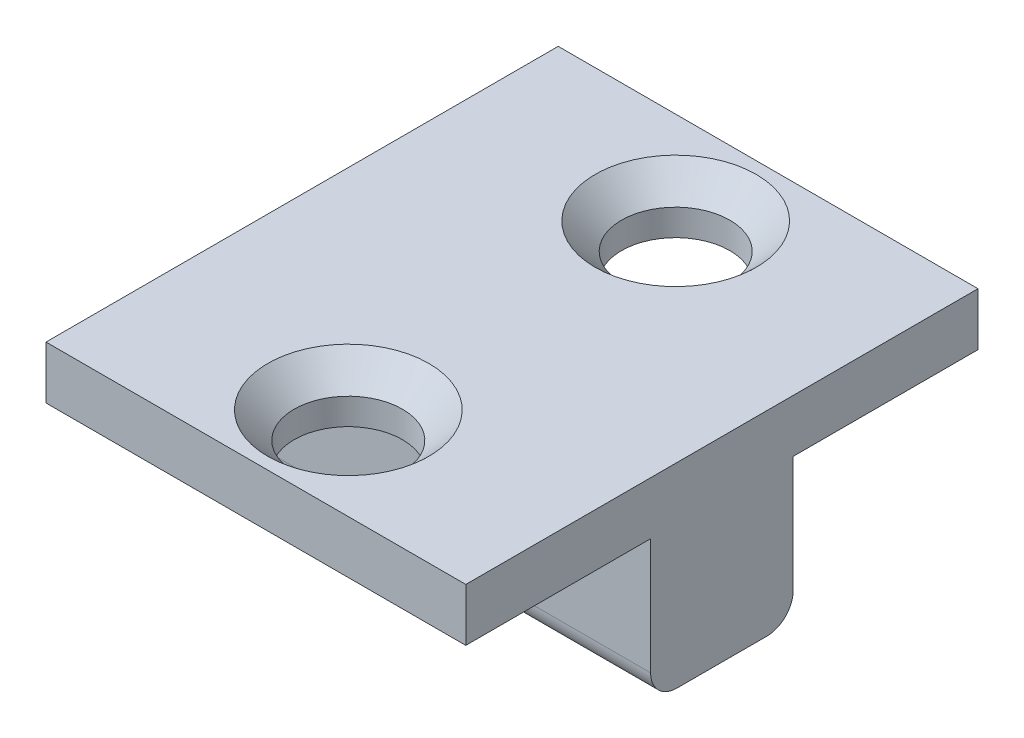
ISO-10303-21;
HEADER;
FILE_DESCRIPTION(('STEP AP214'),'2;1');
FILE_NAME('part.step','',(''),(''),'','','');
FILE_SCHEMA(('AUTOMOTIVE_DESIGN { 1 0 10303 214 1 1 1 1 }'));
ENDSEC;
DATA;
#1=APPLICATION_CONTEXT('core data for automotive mechanical design processes');
#2=APPLICATION_PROTOCOL_DEFINITION('international standard','automotive_design',2000,#1);
#3=PRODUCT_CONTEXT('',#1,'mechanical');
#4=PRODUCT('Part','Part','',(#3));
#5=PRODUCT_RELATED_PRODUCT_CATEGORY('part','',(#4));
#6=PRODUCT_DEFINITION_FORMATION('','',#4);
#7=PRODUCT_DEFINITION_CONTEXT('part definition',#1,'design');
#8=PRODUCT_DEFINITION('design','',#6,#7);
#9=PRODUCT_DEFINITION_SHAPE('','',#8);
#10=(LENGTH_UNIT() NAMED_UNIT(*) SI_UNIT(.MILLI.,.METRE.));
#11=(NAMED_UNIT(*) PLANE_ANGLE_UNIT() SI_UNIT($,.RADIAN.));
#12=(NAMED_UNIT(*) SI_UNIT($,.STERADIAN.) SOLID_ANGLE_UNIT());
#13=UNCERTAINTY_MEASURE_WITH_UNIT(LENGTH_MEASURE(1.E-05),#10,'distance_accuracy_value','');
#14=(GEOMETRIC_REPRESENTATION_CONTEXT(3) GLOBAL_UNCERTAINTY_ASSIGNED_CONTEXT((#13)) GLOBAL_UNIT_ASSIGNED_CONTEXT((#10,
#11,#12)) REPRESENTATION_CONTEXT('',''));
#15=CARTESIAN_POINT('',(0.,0.,0.));
#16=DIRECTION('',(0.,0.,1.));
#17=DIRECTION('',(1.,0.,0.));
#18=AXIS2_PLACEMENT_3D('',#15,#16,#17);
#19=CARTESIAN_POINT('',(7.94999999999999,5.4,-2.7));
#20=DIRECTION('',(-1.,0.,0.));
#21=DIRECTION('',(0.,0.,1.));
#22=AXIS2_PLACEMENT_3D('',#19,#20,#21);
#23=PLANE('',#22);
#24=DIRECTION('',(0.,-1.,0.));
#25=VECTOR('',#24,1.);
#26=CARTESIAN_POINT('',(7.94999999999999,5.4,2.7));
#27=LINE('',#26,#25);
#28=CARTESIAN_POINT('',(7.95,5.4,2.7));
#29=VERTEX_POINT('',#28);
#30=CARTESIAN_POINT('',(7.94999999999999,1.,2.7));
#31=VERTEX_POINT('',#30);
#32=EDGE_CURVE('E155',#29,#31,#27,.T.);
#33=ORIENTED_EDGE('',*,*,#32,.T.);
#34=CARTESIAN_POINT('',(7.94999999999999,1.,1.7));
#35=DIRECTION('',(-1.,0.,0.));
#36=DIRECTION('',(0.,0.,1.));
#37=AXIS2_PLACEMENT_3D('',#34,#35,#36);
#38=CIRCLE('',#37,1.);
#39=CARTESIAN_POINT('',(7.94999999999999,0.,1.7));
#40=VERTEX_POINT('',#39);
#41=EDGE_CURVE('E186',#31,#40,#38,.F.);
#42=ORIENTED_EDGE('',*,*,#41,.T.);
#43=DIRECTION('',(0.,0.,-1.));
#44=VECTOR('',#43,1.);
#45=CARTESIAN_POINT('',(7.94999999999999,0.,-2.7));
#46=LINE('',#45,#44);
#47=CARTESIAN_POINT('',(7.94999999999999,0.,-1.7));
#48=VERTEX_POINT('',#47);
#49=EDGE_CURVE('E141',#40,#48,#46,.T.);
#50=ORIENTED_EDGE('',*,*,#49,.T.);
#51=CARTESIAN_POINT('',(7.94999999999999,1.,-1.7));
#52=DIRECTION('',(-1.,0.,0.));
#53=DIRECTION('',(0.,0.,1.));
#54=AXIS2_PLACEMENT_3D('',#51,#52,#53);
#55=CIRCLE('',#54,1.);
#56=CARTESIAN_POINT('',(7.94999999999999,1.,-2.7));
#57=VERTEX_POINT('',#56);
#58=EDGE_CURVE('E184',#48,#57,#55,.F.);
#59=ORIENTED_EDGE('',*,*,#58,.T.);
#60=DIRECTION('',(0.,-1.,0.));
#61=VECTOR('',#60,1.);
#62=CARTESIAN_POINT('',(7.94999999999999,5.4,-2.7));
#63=LINE('',#62,#61);
#64=CARTESIAN_POINT('',(7.94999999999999,5.4,-2.7));
#65=VERTEX_POINT('',#64);
#66=EDGE_CURVE('E166',#65,#57,#63,.T.);
#67=ORIENTED_EDGE('',*,*,#66,.F.);
#68=DIRECTION('',(0.,0.,-1.));
#69=VECTOR('',#68,1.);
#70=CARTESIAN_POINT('',(7.95,5.4,-9.7));
#71=LINE('',#70,#69);
#72=CARTESIAN_POINT('',(7.95,5.4,-9.7));
#73=VERTEX_POINT('',#72);
#74=EDGE_CURVE('E212',#65,#73,#71,.T.);
#75=ORIENTED_EDGE('',*,*,#74,.T.);
#76=DIRECTION('',(0.,-1.,0.));
#77=VECTOR('',#76,1.);
#78=CARTESIAN_POINT('',(7.95,7.4,-9.7));
#79=LINE('',#78,#77);
#80=CARTESIAN_POINT('',(7.95,7.4,-9.7));
#81=VERTEX_POINT('',#80);
#82=EDGE_CURVE('E146',#81,#73,#79,.T.);
#83=ORIENTED_EDGE('',*,*,#82,.F.);
#84=DIRECTION('',(0.,0.,-1.));
#85=VECTOR('',#84,1.);
#86=CARTESIAN_POINT('',(7.95,7.4,-9.7));
#87=LINE('',#86,#85);
#88=CARTESIAN_POINT('',(7.95,7.4,9.7));
#89=VERTEX_POINT('',#88);
#90=EDGE_CURVE('E125',#89,#81,#87,.T.);
#91=ORIENTED_EDGE('',*,*,#90,.F.);
#92=DIRECTION('',(0.,-1.,0.));
#93=VECTOR('',#92,1.);
#94=CARTESIAN_POINT('',(7.95,7.4,9.7));
#95=LINE('',#94,#93);
#96=CARTESIAN_POINT('',(7.95,5.4,9.7));
#97=VERTEX_POINT('',#96);
#98=EDGE_CURVE('E122',#89,#97,#95,.T.);
#99=ORIENTED_EDGE('',*,*,#98,.T.);
#100=EDGE_CURVE('E221',#97,#29,#71,.T.);
#101=ORIENTED_EDGE('',*,*,#100,.T.);
#102=EDGE_LOOP('',(#33,#42,#50,#59,#67,#75,#83,#91,#99,#101));
#103=FACE_BOUND('',#102,.T.);
#104=ADVANCED_FACE('F37',(#103),#23,.F.);
#105=CARTESIAN_POINT('',(-7.95000000000001,5.4,-2.7));
#106=DIRECTION('',(0.,0.,1.));
#107=DIRECTION('',(1.,0.,0.));
#108=AXIS2_PLACEMENT_3D('',#105,#106,#107);
#109=PLANE('',#108);
#110=ORIENTED_EDGE('',*,*,#66,.T.);
#111=DIRECTION('',(-1.,0.,0.));
#112=VECTOR('',#111,1.);
#113=CARTESIAN_POINT('',(-7.95000000000001,1.,-2.7));
#114=LINE('',#113,#112);
#115=CARTESIAN_POINT('',(-7.95000000000001,1.,-2.7));
#116=VERTEX_POINT('',#115);
#117=EDGE_CURVE('E11',#57,#116,#114,.T.);
#118=ORIENTED_EDGE('',*,*,#117,.T.);
#119=DIRECTION('',(0.,-1.,0.));
#120=VECTOR('',#119,1.);
#121=CARTESIAN_POINT('',(-7.95000000000001,5.4,-2.7));
#122=LINE('',#121,#120);
#123=CARTESIAN_POINT('',(-7.95000000000001,5.4,-2.7));
#124=VERTEX_POINT('',#123);
#125=EDGE_CURVE('E163',#124,#116,#122,.T.);
#126=ORIENTED_EDGE('',*,*,#125,.F.);
#127=DIRECTION('',(-1.,0.,0.));
#128=VECTOR('',#127,1.);
#129=CARTESIAN_POINT('',(-7.95000000000001,5.4,-2.7));
#130=LINE('',#129,#128);
#131=EDGE_CURVE('E150',#65,#124,#130,.T.);
#132=ORIENTED_EDGE('',*,*,#131,.F.);
#133=EDGE_LOOP('',(#110,#118,#126,#132));
#134=FACE_BOUND('',#133,.T.);
#135=ADVANCED_FACE('F205',(#134),#109,.F.);
#136=CARTESIAN_POINT('',(-7.95000000000001,5.4,-2.7));
#137=DIRECTION('',(1.,0.,0.));
#138=DIRECTION('',(0.,0.,-1.));
#139=AXIS2_PLACEMENT_3D('',#136,#137,#138);
#140=PLANE('',#139);
#141=DIRECTION('',(0.,0.,1.));
#142=VECTOR('',#141,1.);
#143=CARTESIAN_POINT('',(-7.95000000000001,0.,-2.7));
#144=LINE('',#143,#142);
#145=CARTESIAN_POINT('',(-7.95000000000001,0.,-1.7));
#146=VERTEX_POINT('',#145);
#147=CARTESIAN_POINT('',(-7.95000000000001,0.,1.7));
#148=VERTEX_POINT('',#147);
#149=EDGE_CURVE('E144',#146,#148,#144,.T.);
#150=ORIENTED_EDGE('',*,*,#149,.T.);
#151=CARTESIAN_POINT('',(-7.95000000000001,1.,1.7));
#152=DIRECTION('',(1.,0.,0.));
#153=DIRECTION('',(0.,0.,-1.));
#154=AXIS2_PLACEMENT_3D('',#151,#152,#153);
#155=CIRCLE('',#154,1.);
#156=CARTESIAN_POINT('',(-7.95000000000001,1.,2.7));
#157=VERTEX_POINT('',#156);
#158=EDGE_CURVE('E45',#148,#157,#155,.F.);
#159=ORIENTED_EDGE('',*,*,#158,.T.);
#160=DIRECTION('',(0.,-1.,0.));
#161=VECTOR('',#160,1.);
#162=CARTESIAN_POINT('',(-7.95000000000001,5.4,2.7));
#163=LINE('',#162,#161);
#164=CARTESIAN_POINT('',(-7.95000000000001,5.4,2.7));
#165=VERTEX_POINT('',#164);
#166=EDGE_CURVE('E160',#165,#157,#163,.T.);
#167=ORIENTED_EDGE('',*,*,#166,.F.);
#168=DIRECTION('',(0.,0.,1.));
#169=VECTOR('',#168,1.);
#170=CARTESIAN_POINT('',(-7.95,5.4,-9.7));
#171=LINE('',#170,#169);
#172=CARTESIAN_POINT('',(-7.95,5.4,9.7));
#173=VERTEX_POINT('',#172);
#174=EDGE_CURVE('E139',#165,#173,#171,.T.);
#175=ORIENTED_EDGE('',*,*,#174,.T.);
#176=DIRECTION('',(0.,-1.,0.));
#177=VECTOR('',#176,1.);
#178=CARTESIAN_POINT('',(-7.95,7.4,9.7));
#179=LINE('',#178,#177);
#180=CARTESIAN_POINT('',(-7.95,7.4,9.7));
#181=VERTEX_POINT('',#180);
#182=EDGE_CURVE('E120',#181,#173,#179,.T.);
#183=ORIENTED_EDGE('',*,*,#182,.F.);
#184=DIRECTION('',(0.,0.,1.));
#185=VECTOR('',#184,1.);
#186=CARTESIAN_POINT('',(-7.95,7.4,-9.7));
#187=LINE('',#186,#185);
#188=CARTESIAN_POINT('',(-7.95,7.4,-9.7));
#189=VERTEX_POINT('',#188);
#190=EDGE_CURVE('E126',#189,#181,#187,.T.);
#191=ORIENTED_EDGE('',*,*,#190,.F.);
#192=DIRECTION('',(0.,-1.,0.));
#193=VECTOR('',#192,1.);
#194=CARTESIAN_POINT('',(-7.95,7.4,-9.7));
#195=LINE('',#194,#193);
#196=CARTESIAN_POINT('',(-7.95,5.4,-9.7));
#197=VERTEX_POINT('',#196);
#198=EDGE_CURVE('E213',#189,#197,#195,.T.);
#199=ORIENTED_EDGE('',*,*,#198,.T.);
#200=EDGE_CURVE('E211',#197,#124,#171,.T.);
#201=ORIENTED_EDGE('',*,*,#200,.T.);
#202=ORIENTED_EDGE('',*,*,#125,.T.);
#203=CARTESIAN_POINT('',(-7.95000000000001,1.,-1.7));
#204=DIRECTION('',(1.,0.,0.));
#205=DIRECTION('',(0.,0.,-1.));
#206=AXIS2_PLACEMENT_3D('',#203,#204,#205);
#207=CIRCLE('',#206,1.);
#208=EDGE_CURVE('E52',#116,#146,#207,.F.);
#209=ORIENTED_EDGE('',*,*,#208,.T.);
#210=EDGE_LOOP('',(#150,#159,#167,#175,#183,#191,#199,#201,#202,#209));
#211=FACE_BOUND('',#210,.T.);
#212=ADVANCED_FACE('F137',(#211),#140,.F.);
#213=CARTESIAN_POINT('',(-7.95000000000001,5.4,2.7));
#214=DIRECTION('',(0.,0.,-1.));
#215=DIRECTION('',(-1.,0.,0.));
#216=AXIS2_PLACEMENT_3D('',#213,#214,#215);
#217=PLANE('',#216);
#218=ORIENTED_EDGE('',*,*,#166,.T.);
#219=DIRECTION('',(1.,0.,0.));
#220=VECTOR('',#219,1.);
#221=CARTESIAN_POINT('',(-7.95000000000001,1.,2.7));
#222=LINE('',#221,#220);
#223=EDGE_CURVE('E181',#157,#31,#222,.T.);
#224=ORIENTED_EDGE('',*,*,#223,.T.);
#225=ORIENTED_EDGE('',*,*,#32,.F.);
#226=DIRECTION('',(1.,0.,0.));
#227=VECTOR('',#226,1.);
#228=CARTESIAN_POINT('',(-7.95000000000001,5.4,2.7));
#229=LINE('',#228,#227);
#230=EDGE_CURVE('E153',#165,#29,#229,.T.);
#231=ORIENTED_EDGE('',*,*,#230,.F.);
#232=EDGE_LOOP('',(#218,#224,#225,#231));
#233=FACE_BOUND('',#232,.T.);
#234=ADVANCED_FACE('F196',(#233),#217,.F.);
#235=CARTESIAN_POINT('',(0.,0.,0.));
#236=DIRECTION('',(0.,1.,0.));
#237=DIRECTION('',(0.,0.,1.));
#238=AXIS2_PLACEMENT_3D('',#235,#236,#237);
#239=PLANE('',#238);
#240=ORIENTED_EDGE('',*,*,#49,.F.);
#241=DIRECTION('',(1.,0.,0.));
#242=VECTOR('',#241,1.);
#243=CARTESIAN_POINT('',(0.,0.,1.7));
#244=LINE('',#243,#242);
#245=EDGE_CURVE('E59',#40,#148,#244,.F.);
#246=ORIENTED_EDGE('',*,*,#245,.T.);
#247=ORIENTED_EDGE('',*,*,#149,.F.);
#248=DIRECTION('',(-1.,0.,0.));
#249=VECTOR('',#248,1.);
#250=CARTESIAN_POINT('',(0.,0.,-1.7));
#251=LINE('',#250,#249);
#252=EDGE_CURVE('E188',#146,#48,#251,.F.);
#253=ORIENTED_EDGE('',*,*,#252,.T.);
#254=EDGE_LOOP('',(#240,#246,#247,#253));
#255=FACE_BOUND('',#254,.T.);
#256=ADVANCED_FACE('F201',(#255),#239,.F.);
#257=CARTESIAN_POINT('',(0.,5.4,0.));
#258=DIRECTION('',(0.,-1.,0.));
#259=DIRECTION('',(0.,0.,-1.));
#260=AXIS2_PLACEMENT_3D('',#257,#258,#259);
#261=PLANE('',#260);
#262=CARTESIAN_POINT('',(0.,5.4,-6.2));
#263=DIRECTION('',(0.,-1.,0.));
#264=DIRECTION('',(0.,0.,-1.));
#265=AXIS2_PLACEMENT_3D('',#262,#263,#264);
#266=CIRCLE('',#265,2.05);
#267=CARTESIAN_POINT('',(0.,5.4,-8.25));
#268=VERTEX_POINT('',#267);
#269=EDGE_CURVE('E217',#268,#268,#266,.T.);
#270=ORIENTED_EDGE('',*,*,#269,.F.);
#271=EDGE_LOOP('',(#270));
#272=FACE_BOUND('',#271,.T.);
#273=ORIENTED_EDGE('',*,*,#74,.F.);
#274=ORIENTED_EDGE('',*,*,#131,.T.);
#275=ORIENTED_EDGE('',*,*,#200,.F.);
#276=DIRECTION('',(-1.,0.,0.));
#277=VECTOR('',#276,1.);
#278=CARTESIAN_POINT('',(7.95,5.4,-9.7));
#279=LINE('',#278,#277);
#280=EDGE_CURVE('E135',#73,#197,#279,.T.);
#281=ORIENTED_EDGE('',*,*,#280,.F.);
#282=EDGE_LOOP('',(#273,#274,#275,#281));
#283=FACE_BOUND('',#282,.T.);
#284=ADVANCED_FACE('F209',(#272,#283),#261,.T.);
#285=CARTESIAN_POINT('',(7.95,7.4,9.7));
#286=DIRECTION('',(0.,0.,-1.));
#287=DIRECTION('',(-1.,0.,0.));
#288=AXIS2_PLACEMENT_3D('',#285,#286,#287);
#289=PLANE('',#288);
#290=DIRECTION('',(1.,0.,0.));
#291=VECTOR('',#290,1.);
#292=CARTESIAN_POINT('',(7.95,5.4,9.7));
#293=LINE('',#292,#291);
#294=EDGE_CURVE('E214',#173,#97,#293,.T.);
#295=ORIENTED_EDGE('',*,*,#294,.T.);
#296=ORIENTED_EDGE('',*,*,#98,.F.);
#297=DIRECTION('',(1.,0.,0.));
#298=VECTOR('',#297,1.);
#299=CARTESIAN_POINT('',(7.95,7.4,9.7));
#300=LINE('',#299,#298);
#301=EDGE_CURVE('E116',#181,#89,#300,.T.);
#302=ORIENTED_EDGE('',*,*,#301,.F.);
#303=ORIENTED_EDGE('',*,*,#182,.T.);
#304=EDGE_LOOP('',(#295,#296,#302,#303));
#305=FACE_BOUND('',#304,.T.);
#306=ADVANCED_FACE('F118',(#305),#289,.F.);
#307=CARTESIAN_POINT('',(7.95,7.4,-9.7));
#308=DIRECTION('',(0.,0.,1.));
#309=DIRECTION('',(1.,0.,0.));
#310=AXIS2_PLACEMENT_3D('',#307,#308,#309);
#311=PLANE('',#310);
#312=ORIENTED_EDGE('',*,*,#280,.T.);
#313=ORIENTED_EDGE('',*,*,#198,.F.);
#314=DIRECTION('',(-1.,0.,0.));
#315=VECTOR('',#314,1.);
#316=CARTESIAN_POINT('',(7.95,7.4,-9.7));
#317=LINE('',#316,#315);
#318=EDGE_CURVE('E131',#81,#189,#317,.T.);
#319=ORIENTED_EDGE('',*,*,#318,.F.);
#320=ORIENTED_EDGE('',*,*,#82,.T.);
#321=EDGE_LOOP('',(#312,#313,#319,#320));
#322=FACE_BOUND('',#321,.T.);
#323=ADVANCED_FACE('F227',(#322),#311,.F.);
#324=CARTESIAN_POINT('',(0.,7.4,0.));
#325=DIRECTION('',(0.,-1.,0.));
#326=DIRECTION('',(0.,0.,-1.));
#327=AXIS2_PLACEMENT_3D('',#324,#325,#326);
#328=PLANE('',#327);
#329=CARTESIAN_POINT('',(0.,7.4,6.2));
#330=DIRECTION('',(0.,-1.,0.));
#331=DIRECTION('',(0.,0.,-1.));
#332=AXIS2_PLACEMENT_3D('',#329,#330,#331);
#333=CIRCLE('',#332,3.05000000000001);
#334=CARTESIAN_POINT('',(0.,7.4,3.14999999999999));
#335=VERTEX_POINT('',#334);
#336=EDGE_CURVE('E175',#335,#335,#333,.T.);
#337=ORIENTED_EDGE('',*,*,#336,.T.);
#338=EDGE_LOOP('',(#337));
#339=FACE_BOUND('',#338,.T.);
#340=CARTESIAN_POINT('',(0.,7.4,-6.2));
#341=DIRECTION('',(0.,-1.,0.));
#342=DIRECTION('',(0.,0.,-1.));
#343=AXIS2_PLACEMENT_3D('',#340,#341,#342);
#344=CIRCLE('',#343,3.05);
#345=CARTESIAN_POINT('',(0.,7.4,-9.25000000000001));
#346=VERTEX_POINT('',#345);
#347=EDGE_CURVE('E172',#346,#346,#344,.T.);
#348=ORIENTED_EDGE('',*,*,#347,.T.);
#349=EDGE_LOOP('',(#348));
#350=FACE_BOUND('',#349,.T.);
#351=ORIENTED_EDGE('',*,*,#190,.T.);
#352=ORIENTED_EDGE('',*,*,#301,.T.);
#353=ORIENTED_EDGE('',*,*,#90,.T.);
#354=ORIENTED_EDGE('',*,*,#318,.T.);
#355=EDGE_LOOP('',(#351,#352,#353,#354));
#356=FACE_BOUND('',#355,.T.);
#357=ADVANCED_FACE('F129',(#339,#350,#356),#328,.F.);
#358=CARTESIAN_POINT('',(0.,5.4,6.2));
#359=DIRECTION('',(0.,1.,0.));
#360=DIRECTION('',(0.,0.,1.));
#361=AXIS2_PLACEMENT_3D('',#358,#359,#360);
#362=CIRCLE('',#361,2.05);
#363=CARTESIAN_POINT('',(0.,5.4,8.25));
#364=VERTEX_POINT('',#363);
#365=EDGE_CURVE('E232',#364,#364,#362,.T.);
#366=ORIENTED_EDGE('',*,*,#365,.T.);
#367=EDGE_LOOP('',(#366));
#368=FACE_BOUND('',#367,.T.);
#369=ORIENTED_EDGE('',*,*,#174,.F.);
#370=ORIENTED_EDGE('',*,*,#230,.T.);
#371=ORIENTED_EDGE('',*,*,#100,.F.);
#372=ORIENTED_EDGE('',*,*,#294,.F.);
#373=EDGE_LOOP('',(#369,#370,#371,#372));
#374=FACE_BOUND('',#373,.T.);
#375=ADVANCED_FACE('F236',(#368,#374),#261,.T.);
#376=CARTESIAN_POINT('',(0.,7.4,-6.2));
#377=DIRECTION('',(0.,-1.,0.));
#378=DIRECTION('',(0.,0.,-1.));
#379=AXIS2_PLACEMENT_3D('',#376,#377,#378);
#380=CYLINDRICAL_SURFACE('',#379,2.05);
#381=CARTESIAN_POINT('',(0.,6.4,-6.2));
#382=DIRECTION('',(0.,-1.,0.));
#383=DIRECTION('',(0.,0.,-1.));
#384=AXIS2_PLACEMENT_3D('',#381,#382,#383);
#385=CIRCLE('',#384,2.05);
#386=CARTESIAN_POINT('',(0.,6.4,-8.25));
#387=VERTEX_POINT('',#386);
#388=EDGE_CURVE('E178',#387,#387,#385,.F.);
#389=ORIENTED_EDGE('',*,*,#388,.T.);
#390=EDGE_LOOP('',(#389));
#391=FACE_BOUND('',#390,.T.);
#392=ORIENTED_EDGE('',*,*,#269,.T.);
#393=EDGE_LOOP('',(#392));
#394=FACE_BOUND('',#393,.T.);
#395=ADVANCED_FACE('F242',(#391,#394),#380,.F.);
#396=CARTESIAN_POINT('',(0.,7.4,6.2));
#397=DIRECTION('',(0.,-1.,0.));
#398=DIRECTION('',(0.,0.,-1.));
#399=AXIS2_PLACEMENT_3D('',#396,#397,#398);
#400=CYLINDRICAL_SURFACE('',#399,2.05);
#401=CARTESIAN_POINT('',(0.,6.4,6.2));
#402=DIRECTION('',(0.,-1.,0.));
#403=DIRECTION('',(0.,0.,-1.));
#404=AXIS2_PLACEMENT_3D('',#401,#402,#403);
#405=CIRCLE('',#404,2.05);
#406=CARTESIAN_POINT('',(0.,6.4,4.15));
#407=VERTEX_POINT('',#406);
#408=EDGE_CURVE('E169',#407,#407,#405,.F.);
#409=ORIENTED_EDGE('',*,*,#408,.T.);
#410=EDGE_LOOP('',(#409));
#411=FACE_BOUND('',#410,.T.);
#412=ORIENTED_EDGE('',*,*,#365,.F.);
#413=EDGE_LOOP('',(#412));
#414=FACE_BOUND('',#413,.T.);
#415=ADVANCED_FACE('F239',(#411,#414),#400,.F.);
#416=CARTESIAN_POINT('',(0.,6.4,6.2));
#417=DIRECTION('',(0.,1.,0.));
#418=DIRECTION('',(0.,0.,1.));
#419=AXIS2_PLACEMENT_3D('',#416,#417,#418);
#420=CONICAL_SURFACE('',#419,2.05,0.78539816339745);
#421=ORIENTED_EDGE('',*,*,#336,.F.);
#422=EDGE_LOOP('',(#421));
#423=FACE_BOUND('',#422,.T.);
#424=ORIENTED_EDGE('',*,*,#408,.F.);
#425=EDGE_LOOP('',(#424));
#426=FACE_BOUND('',#425,.T.);
#427=ADVANCED_FACE('F241',(#423,#426),#420,.F.);
#428=CARTESIAN_POINT('',(0.,7.4,-6.2));
#429=DIRECTION('',(0.,1.,0.));
#430=DIRECTION('',(0.,0.,1.));
#431=AXIS2_PLACEMENT_3D('',#428,#429,#430);
#432=CONICAL_SURFACE('',#431,3.05,0.785398163397449);
#433=ORIENTED_EDGE('',*,*,#388,.F.);
#434=EDGE_LOOP('',(#433));
#435=FACE_BOUND('',#434,.T.);
#436=ORIENTED_EDGE('',*,*,#347,.F.);
#437=EDGE_LOOP('',(#436));
#438=FACE_BOUND('',#437,.T.);
#439=ADVANCED_FACE('F249',(#435,#438),#432,.F.);
#440=CARTESIAN_POINT('',(-7.95000000000001,1.,1.7));
#441=DIRECTION('',(1.,0.,0.));
#442=DIRECTION('',(0.,0.,-1.));
#443=AXIS2_PLACEMENT_3D('',#440,#441,#442);
#444=CYLINDRICAL_SURFACE('',#443,1.);
#445=ORIENTED_EDGE('',*,*,#158,.F.);
#446=ORIENTED_EDGE('',*,*,#245,.F.);
#447=ORIENTED_EDGE('',*,*,#41,.F.);
#448=ORIENTED_EDGE('',*,*,#223,.F.);
#449=EDGE_LOOP('',(#445,#446,#447,#448));
#450=FACE_BOUND('',#449,.T.);
#451=ADVANCED_FACE('F197',(#450),#444,.T.);
#452=CARTESIAN_POINT('',(-7.95000000000001,1.,-1.7));
#453=DIRECTION('',(-1.,0.,0.));
#454=DIRECTION('',(0.,0.,1.));
#455=AXIS2_PLACEMENT_3D('',#452,#453,#454);
#456=CYLINDRICAL_SURFACE('',#455,1.);
#457=ORIENTED_EDGE('',*,*,#58,.F.);
#458=ORIENTED_EDGE('',*,*,#252,.F.);
#459=ORIENTED_EDGE('',*,*,#208,.F.);
#460=ORIENTED_EDGE('',*,*,#117,.F.);
#461=EDGE_LOOP('',(#457,#458,#459,#460));
#462=FACE_BOUND('',#461,.T.);
#463=ADVANCED_FACE('F39',(#462),#456,.T.);
#464=CLOSED_SHELL('',(#104,#135,#212,#234,#256,#284,#306,#323,#357,#375,#395,#415,#427,#439,
#451,#463));
#465=MANIFOLD_SOLID_BREP('B2',#464);
#466=ADVANCED_BREP_SHAPE_REPRESENTATION('',(#18,#465),#14);
#467=SHAPE_DEFINITION_REPRESENTATION(#9,#466);
ENDSEC;
END-ISO-10303-21;
